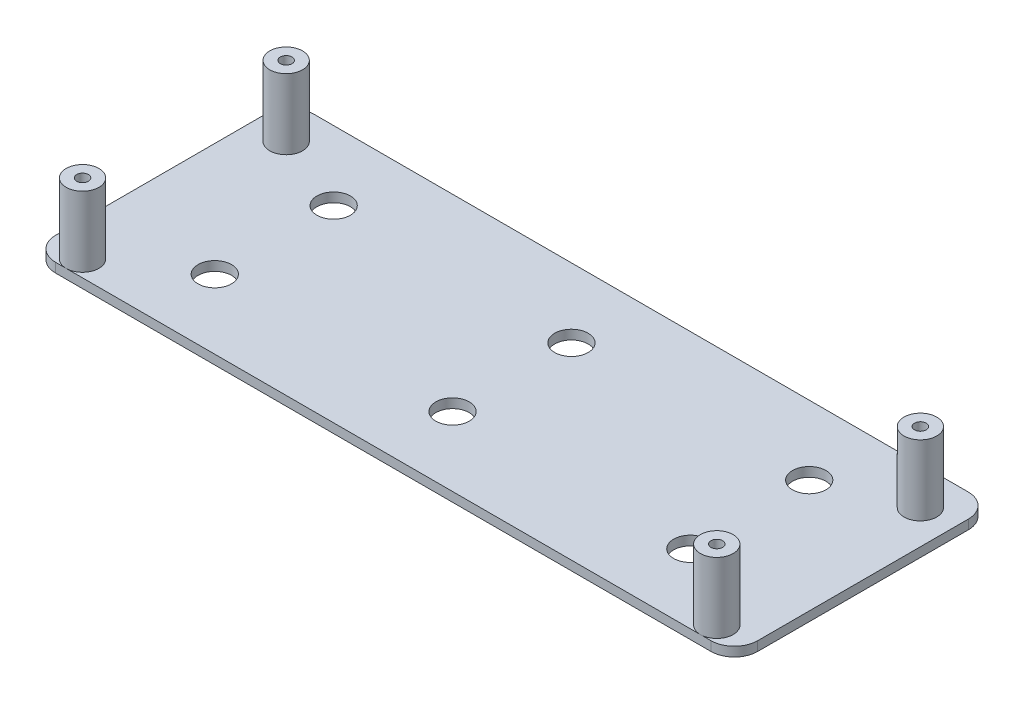
ISO-10303-21;
HEADER;
FILE_DESCRIPTION(('STEP AP214'),'2;1');
FILE_NAME('part.step','',(''),(''),'','','');
FILE_SCHEMA(('AUTOMOTIVE_DESIGN { 1 0 10303 214 1 1 1 1 }'));
ENDSEC;
DATA;
#1=APPLICATION_CONTEXT('core data for automotive mechanical design processes');
#2=APPLICATION_PROTOCOL_DEFINITION('international standard','automotive_design',2000,#1);
#3=PRODUCT_CONTEXT('',#1,'mechanical');
#4=PRODUCT('Part','Part','',(#3));
#5=PRODUCT_RELATED_PRODUCT_CATEGORY('part','',(#4));
#6=PRODUCT_DEFINITION_FORMATION('','',#4);
#7=PRODUCT_DEFINITION_CONTEXT('part definition',#1,'design');
#8=PRODUCT_DEFINITION('design','',#6,#7);
#9=PRODUCT_DEFINITION_SHAPE('','',#8);
#10=(LENGTH_UNIT() NAMED_UNIT(*) SI_UNIT(.MILLI.,.METRE.));
#11=(NAMED_UNIT(*) PLANE_ANGLE_UNIT() SI_UNIT($,.RADIAN.));
#12=(NAMED_UNIT(*) SI_UNIT($,.STERADIAN.) SOLID_ANGLE_UNIT());
#13=UNCERTAINTY_MEASURE_WITH_UNIT(LENGTH_MEASURE(1.E-05),#10,'distance_accuracy_value','');
#14=(GEOMETRIC_REPRESENTATION_CONTEXT(3) GLOBAL_UNCERTAINTY_ASSIGNED_CONTEXT((#13)) GLOBAL_UNIT_ASSIGNED_CONTEXT((#10,
#11,#12)) REPRESENTATION_CONTEXT('',''));
#15=CARTESIAN_POINT('',(0.,0.,0.));
#16=DIRECTION('',(0.,0.,1.));
#17=DIRECTION('',(1.,0.,0.));
#18=AXIS2_PLACEMENT_3D('',#15,#16,#17);
#19=CARTESIAN_POINT('',(67.75,-0.001000000000001,24.));
#20=DIRECTION('',(0.,1.,0.));
#21=DIRECTION('',(0.,0.,1.));
#22=AXIS2_PLACEMENT_3D('',#19,#20,#21);
#23=CYLINDRICAL_SURFACE('',#22,1.25);
#24=CARTESIAN_POINT('',(67.75,17.,24.));
#25=DIRECTION('',(0.,1.,0.));
#26=DIRECTION('',(0.,0.,1.));
#27=AXIS2_PLACEMENT_3D('',#24,#25,#26);
#28=CIRCLE('',#27,1.25);
#29=CARTESIAN_POINT('',(67.75,17.,25.25));
#30=VERTEX_POINT('',#29);
#31=EDGE_CURVE('E274',#30,#30,#28,.T.);
#32=ORIENTED_EDGE('',*,*,#31,.T.);
#33=EDGE_LOOP('',(#32));
#34=FACE_BOUND('',#33,.T.);
#35=CARTESIAN_POINT('',(67.75,10.,24.));
#36=DIRECTION('',(0.,-1.,0.));
#37=DIRECTION('',(0.,0.,-1.));
#38=AXIS2_PLACEMENT_3D('',#35,#36,#37);
#39=CIRCLE('',#38,1.25);
#40=CARTESIAN_POINT('',(67.75,10.,22.75));
#41=VERTEX_POINT('',#40);
#42=EDGE_CURVE('E45',#41,#41,#39,.F.);
#43=ORIENTED_EDGE('',*,*,#42,.F.);
#44=EDGE_LOOP('',(#43));
#45=FACE_BOUND('',#44,.T.);
#46=ADVANCED_FACE('F41',(#34,#45),#23,.F.);
#47=CARTESIAN_POINT('',(67.75,-0.001000000000001,-19.5));
#48=DIRECTION('',(0.,1.,0.));
#49=DIRECTION('',(0.,0.,1.));
#50=AXIS2_PLACEMENT_3D('',#47,#48,#49);
#51=CYLINDRICAL_SURFACE('',#50,1.25);
#52=CARTESIAN_POINT('',(67.75,17.,-19.5));
#53=DIRECTION('',(0.,1.,0.));
#54=DIRECTION('',(0.,0.,1.));
#55=AXIS2_PLACEMENT_3D('',#52,#53,#54);
#56=CIRCLE('',#55,1.25);
#57=CARTESIAN_POINT('',(67.75,17.,-18.25));
#58=VERTEX_POINT('',#57);
#59=EDGE_CURVE('E280',#58,#58,#56,.T.);
#60=ORIENTED_EDGE('',*,*,#59,.T.);
#61=EDGE_LOOP('',(#60));
#62=FACE_BOUND('',#61,.T.);
#63=CARTESIAN_POINT('',(67.75,10.,-19.5));
#64=DIRECTION('',(0.,-1.,0.));
#65=DIRECTION('',(0.,0.,-1.));
#66=AXIS2_PLACEMENT_3D('',#63,#64,#65);
#67=CIRCLE('',#66,1.25);
#68=CARTESIAN_POINT('',(67.75,10.,-20.75));
#69=VERTEX_POINT('',#68);
#70=EDGE_CURVE('E211',#69,#69,#67,.F.);
#71=ORIENTED_EDGE('',*,*,#70,.F.);
#72=EDGE_LOOP('',(#71));
#73=FACE_BOUND('',#72,.T.);
#74=ADVANCED_FACE('F357',(#62,#73),#51,.F.);
#75=CARTESIAN_POINT('',(-67.75,-0.001000000000001,-19.5));
#76=DIRECTION('',(0.,1.,0.));
#77=DIRECTION('',(0.,0.,1.));
#78=AXIS2_PLACEMENT_3D('',#75,#76,#77);
#79=CYLINDRICAL_SURFACE('',#78,1.25);
#80=CARTESIAN_POINT('',(-67.75,17.,-19.5));
#81=DIRECTION('',(0.,1.,0.));
#82=DIRECTION('',(0.,0.,1.));
#83=AXIS2_PLACEMENT_3D('',#80,#81,#82);
#84=CIRCLE('',#83,1.25);
#85=CARTESIAN_POINT('',(-67.75,17.,-18.25));
#86=VERTEX_POINT('',#85);
#87=EDGE_CURVE('E275',#86,#86,#84,.T.);
#88=ORIENTED_EDGE('',*,*,#87,.T.);
#89=EDGE_LOOP('',(#88));
#90=FACE_BOUND('',#89,.T.);
#91=CARTESIAN_POINT('',(-67.75,10.,-19.5));
#92=DIRECTION('',(0.,-1.,0.));
#93=DIRECTION('',(0.,0.,-1.));
#94=AXIS2_PLACEMENT_3D('',#91,#92,#93);
#95=CIRCLE('',#94,1.25);
#96=CARTESIAN_POINT('',(-67.75,10.,-20.75));
#97=VERTEX_POINT('',#96);
#98=EDGE_CURVE('E207',#97,#97,#95,.F.);
#99=ORIENTED_EDGE('',*,*,#98,.F.);
#100=EDGE_LOOP('',(#99));
#101=FACE_BOUND('',#100,.T.);
#102=ADVANCED_FACE('F363',(#90,#101),#79,.F.);
#103=CARTESIAN_POINT('',(-67.75,-0.001000000000001,24.));
#104=DIRECTION('',(0.,1.,0.));
#105=DIRECTION('',(0.,0.,1.));
#106=AXIS2_PLACEMENT_3D('',#103,#104,#105);
#107=CYLINDRICAL_SURFACE('',#106,1.25);
#108=CARTESIAN_POINT('',(-67.75,17.,24.));
#109=DIRECTION('',(0.,1.,0.));
#110=DIRECTION('',(0.,0.,1.));
#111=AXIS2_PLACEMENT_3D('',#108,#109,#110);
#112=CIRCLE('',#111,1.25);
#113=CARTESIAN_POINT('',(-67.75,17.,25.25));
#114=VERTEX_POINT('',#113);
#115=EDGE_CURVE('E279',#114,#114,#112,.T.);
#116=ORIENTED_EDGE('',*,*,#115,.T.);
#117=EDGE_LOOP('',(#116));
#118=FACE_BOUND('',#117,.T.);
#119=CARTESIAN_POINT('',(-67.75,10.,24.));
#120=DIRECTION('',(0.,-1.,0.));
#121=DIRECTION('',(0.,0.,-1.));
#122=AXIS2_PLACEMENT_3D('',#119,#120,#121);
#123=CIRCLE('',#122,1.25);
#124=CARTESIAN_POINT('',(-67.75,10.,22.75));
#125=VERTEX_POINT('',#124);
#126=EDGE_CURVE('E203',#125,#125,#123,.F.);
#127=ORIENTED_EDGE('',*,*,#126,.F.);
#128=EDGE_LOOP('',(#127));
#129=FACE_BOUND('',#128,.T.);
#130=ADVANCED_FACE('F369',(#118,#129),#107,.F.);
#131=CARTESIAN_POINT('',(0.,2.,0.));
#132=DIRECTION('',(0.,-1.,0.));
#133=DIRECTION('',(0.,0.,-1.));
#134=AXIS2_PLACEMENT_3D('',#131,#132,#133);
#135=PLANE('',#134);
#136=CARTESIAN_POINT('',(67.75,2.,-19.5));
#137=DIRECTION('',(0.,-1.,0.));
#138=DIRECTION('',(0.,0.,-1.));
#139=AXIS2_PLACEMENT_3D('',#136,#137,#138);
#140=CIRCLE('',#139,3.50000000000002);
#141=CARTESIAN_POINT('',(67.75,2.,-23.));
#142=VERTEX_POINT('',#141);
#143=EDGE_CURVE('E146',#142,#142,#140,.F.);
#144=ORIENTED_EDGE('',*,*,#143,.F.);
#145=EDGE_LOOP('',(#144));
#146=FACE_BOUND('',#145,.T.);
#147=CARTESIAN_POINT('',(-67.75,2.,-19.5));
#148=DIRECTION('',(0.,-1.,0.));
#149=DIRECTION('',(0.,0.,-1.));
#150=AXIS2_PLACEMENT_3D('',#147,#148,#149);
#151=CIRCLE('',#150,3.50000000000002);
#152=CARTESIAN_POINT('',(-67.75,2.,-23.));
#153=VERTEX_POINT('',#152);
#154=EDGE_CURVE('E143',#153,#153,#151,.F.);
#155=ORIENTED_EDGE('',*,*,#154,.F.);
#156=EDGE_LOOP('',(#155));
#157=FACE_BOUND('',#156,.T.);
#158=DIRECTION('',(-1.,0.,0.));
#159=VECTOR('',#158,1.);
#160=CARTESIAN_POINT('',(-75.,2.,-27.5));
#161=LINE('',#160,#159);
#162=CARTESIAN_POINT('',(70.,2.,-27.5));
#163=VERTEX_POINT('',#162);
#164=CARTESIAN_POINT('',(-70.,2.,-27.5));
#165=VERTEX_POINT('',#164);
#166=EDGE_CURVE('E139',#163,#165,#161,.T.);
#167=ORIENTED_EDGE('',*,*,#166,.T.);
#168=CARTESIAN_POINT('',(-70.,2.,-22.5));
#169=DIRECTION('',(0.,-1.,0.));
#170=DIRECTION('',(0.,0.,-1.));
#171=AXIS2_PLACEMENT_3D('',#168,#169,#170);
#172=CIRCLE('',#171,5.);
#173=CARTESIAN_POINT('',(-75.,2.,-22.5));
#174=VERTEX_POINT('',#173);
#175=EDGE_CURVE('E191',#165,#174,#172,.F.);
#176=ORIENTED_EDGE('',*,*,#175,.T.);
#177=DIRECTION('',(0.,0.,1.));
#178=VECTOR('',#177,1.);
#179=CARTESIAN_POINT('',(-75.,2.,27.5));
#180=LINE('',#179,#178);
#181=CARTESIAN_POINT('',(-75.,2.,22.5));
#182=VERTEX_POINT('',#181);
#183=EDGE_CURVE('E137',#174,#182,#180,.T.);
#184=ORIENTED_EDGE('',*,*,#183,.T.);
#185=CARTESIAN_POINT('',(-70.,2.,22.5));
#186=DIRECTION('',(0.,-1.,0.));
#187=DIRECTION('',(0.,0.,-1.));
#188=AXIS2_PLACEMENT_3D('',#185,#186,#187);
#189=CIRCLE('',#188,5.);
#190=CARTESIAN_POINT('',(-70.,2.,27.5));
#191=VERTEX_POINT('',#190);
#192=EDGE_CURVE('E59',#182,#191,#189,.F.);
#193=ORIENTED_EDGE('',*,*,#192,.T.);
#194=DIRECTION('',(1.,0.,0.));
#195=VECTOR('',#194,1.);
#196=CARTESIAN_POINT('',(-75.,2.,27.5));
#197=LINE('',#196,#195);
#198=CARTESIAN_POINT('',(-67.75,2.,27.5));
#199=VERTEX_POINT('',#198);
#200=EDGE_CURVE('E129',#191,#199,#197,.T.);
#201=ORIENTED_EDGE('',*,*,#200,.T.);
#202=CARTESIAN_POINT('',(-67.75,2.,24.));
#203=DIRECTION('',(0.,1.,0.));
#204=DIRECTION('',(0.,0.,1.));
#205=AXIS2_PLACEMENT_3D('',#202,#203,#204);
#206=CIRCLE('',#205,3.50000000000002);
#207=EDGE_CURVE('E126',#199,#199,#206,.T.);
#208=ORIENTED_EDGE('',*,*,#207,.F.);
#209=CARTESIAN_POINT('',(67.75,2.,27.5));
#210=VERTEX_POINT('',#209);
#211=EDGE_CURVE('E117',#199,#210,#197,.T.);
#212=ORIENTED_EDGE('',*,*,#211,.T.);
#213=CARTESIAN_POINT('',(67.75,2.,24.));
#214=DIRECTION('',(0.,1.,0.));
#215=DIRECTION('',(0.,0.,1.));
#216=AXIS2_PLACEMENT_3D('',#213,#214,#215);
#217=CIRCLE('',#216,3.50000000000002);
#218=EDGE_CURVE('E124',#210,#210,#217,.T.);
#219=ORIENTED_EDGE('',*,*,#218,.F.);
#220=CARTESIAN_POINT('',(70.,2.,27.5));
#221=VERTEX_POINT('',#220);
#222=EDGE_CURVE('E130',#210,#221,#197,.T.);
#223=ORIENTED_EDGE('',*,*,#222,.T.);
#224=CARTESIAN_POINT('',(70.,2.,22.5));
#225=DIRECTION('',(0.,-1.,0.));
#226=DIRECTION('',(0.,0.,-1.));
#227=AXIS2_PLACEMENT_3D('',#224,#225,#226);
#228=CIRCLE('',#227,5.);
#229=CARTESIAN_POINT('',(75.,2.,22.5));
#230=VERTEX_POINT('',#229);
#231=EDGE_CURVE('E185',#221,#230,#228,.F.);
#232=ORIENTED_EDGE('',*,*,#231,.T.);
#233=DIRECTION('',(0.,0.,-1.));
#234=VECTOR('',#233,1.);
#235=CARTESIAN_POINT('',(75.,2.,27.5));
#236=LINE('',#235,#234);
#237=CARTESIAN_POINT('',(75.,2.,-22.5));
#238=VERTEX_POINT('',#237);
#239=EDGE_CURVE('E311',#230,#238,#236,.T.);
#240=ORIENTED_EDGE('',*,*,#239,.T.);
#241=CARTESIAN_POINT('',(70.,2.,-22.5));
#242=DIRECTION('',(0.,-1.,0.));
#243=DIRECTION('',(0.,0.,-1.));
#244=AXIS2_PLACEMENT_3D('',#241,#242,#243);
#245=CIRCLE('',#244,5.);
#246=EDGE_CURVE('E188',#238,#163,#245,.F.);
#247=ORIENTED_EDGE('',*,*,#246,.T.);
#248=EDGE_LOOP('',(#167,#176,#184,#193,#201,#208,#212,#219,#223,#232,#240,#247));
#249=FACE_BOUND('',#248,.T.);
#250=CARTESIAN_POINT('',(0.,2.,-12.7));
#251=DIRECTION('',(0.,1.,0.));
#252=DIRECTION('',(0.,0.,1.));
#253=AXIS2_PLACEMENT_3D('',#250,#251,#252);
#254=CIRCLE('',#253,3.57124);
#255=CARTESIAN_POINT('',(0.,2.,-9.12876));
#256=VERTEX_POINT('',#255);
#257=EDGE_CURVE('E266',#256,#256,#254,.T.);
#258=ORIENTED_EDGE('',*,*,#257,.F.);
#259=EDGE_LOOP('',(#258));
#260=FACE_BOUND('',#259,.T.);
#261=CARTESIAN_POINT('',(0.,2.,12.7));
#262=DIRECTION('',(0.,1.,0.));
#263=DIRECTION('',(0.,0.,1.));
#264=AXIS2_PLACEMENT_3D('',#261,#262,#263);
#265=CIRCLE('',#264,3.57124);
#266=CARTESIAN_POINT('',(0.,2.,16.27124));
#267=VERTEX_POINT('',#266);
#268=EDGE_CURVE('E258',#267,#267,#265,.T.);
#269=ORIENTED_EDGE('',*,*,#268,.F.);
#270=EDGE_LOOP('',(#269));
#271=FACE_BOUND('',#270,.T.);
#272=CARTESIAN_POINT('',(-50.8,2.,12.7));
#273=DIRECTION('',(0.,1.,0.));
#274=DIRECTION('',(0.,0.,1.));
#275=AXIS2_PLACEMENT_3D('',#272,#273,#274);
#276=CIRCLE('',#275,3.57124);
#277=CARTESIAN_POINT('',(-50.8,2.,16.27124));
#278=VERTEX_POINT('',#277);
#279=EDGE_CURVE('E250',#278,#278,#276,.T.);
#280=ORIENTED_EDGE('',*,*,#279,.F.);
#281=EDGE_LOOP('',(#280));
#282=FACE_BOUND('',#281,.T.);
#283=CARTESIAN_POINT('',(50.8,2.,12.7));
#284=DIRECTION('',(0.,1.,0.));
#285=DIRECTION('',(0.,0.,1.));
#286=AXIS2_PLACEMENT_3D('',#283,#284,#285);
#287=CIRCLE('',#286,3.57124);
#288=CARTESIAN_POINT('',(50.8,2.,16.27124));
#289=VERTEX_POINT('',#288);
#290=EDGE_CURVE('E242',#289,#289,#287,.T.);
#291=ORIENTED_EDGE('',*,*,#290,.F.);
#292=EDGE_LOOP('',(#291));
#293=FACE_BOUND('',#292,.T.);
#294=CARTESIAN_POINT('',(50.8,2.,-12.7));
#295=DIRECTION('',(0.,1.,0.));
#296=DIRECTION('',(0.,0.,1.));
#297=AXIS2_PLACEMENT_3D('',#294,#295,#296);
#298=CIRCLE('',#297,3.57124);
#299=CARTESIAN_POINT('',(50.8,2.,-9.12876));
#300=VERTEX_POINT('',#299);
#301=EDGE_CURVE('E229',#300,#300,#298,.T.);
#302=ORIENTED_EDGE('',*,*,#301,.F.);
#303=EDGE_LOOP('',(#302));
#304=FACE_BOUND('',#303,.T.);
#305=CARTESIAN_POINT('',(-50.8,2.,-12.7));
#306=DIRECTION('',(0.,1.,0.));
#307=DIRECTION('',(0.,0.,1.));
#308=AXIS2_PLACEMENT_3D('',#305,#306,#307);
#309=CIRCLE('',#308,3.57124);
#310=CARTESIAN_POINT('',(-50.8,2.,-9.12876));
#311=VERTEX_POINT('',#310);
#312=EDGE_CURVE('E218',#311,#311,#309,.T.);
#313=ORIENTED_EDGE('',*,*,#312,.F.);
#314=EDGE_LOOP('',(#313));
#315=FACE_BOUND('',#314,.T.);
#316=ADVANCED_FACE('F120',(#146,#157,#249,#260,#271,#282,#293,#304,#315),#135,.F.);
#317=CARTESIAN_POINT('',(75.,2.,27.5));
#318=DIRECTION('',(-1.,0.,0.));
#319=DIRECTION('',(0.,0.,1.));
#320=AXIS2_PLACEMENT_3D('',#317,#318,#319);
#321=PLANE('',#320);
#322=DIRECTION('',(0.,0.,-1.));
#323=VECTOR('',#322,1.);
#324=CARTESIAN_POINT('',(75.,0.,27.5));
#325=LINE('',#324,#323);
#326=CARTESIAN_POINT('',(75.,0.,22.5));
#327=VERTEX_POINT('',#326);
#328=CARTESIAN_POINT('',(75.,0.,-22.5));
#329=VERTEX_POINT('',#328);
#330=EDGE_CURVE('E308',#327,#329,#325,.T.);
#331=ORIENTED_EDGE('',*,*,#330,.T.);
#332=DIRECTION('',(0.,-1.,0.));
#333=VECTOR('',#332,1.);
#334=CARTESIAN_POINT('',(75.,2.,-22.5));
#335=LINE('',#334,#333);
#336=EDGE_CURVE('E67',#329,#238,#335,.F.);
#337=ORIENTED_EDGE('',*,*,#336,.T.);
#338=ORIENTED_EDGE('',*,*,#239,.F.);
#339=DIRECTION('',(0.,-1.,0.));
#340=VECTOR('',#339,1.);
#341=CARTESIAN_POINT('',(75.,2.,22.5));
#342=LINE('',#341,#340);
#343=EDGE_CURVE('E194',#230,#327,#342,.T.);
#344=ORIENTED_EDGE('',*,*,#343,.T.);
#345=EDGE_LOOP('',(#331,#337,#338,#344));
#346=FACE_BOUND('',#345,.T.);
#347=ADVANCED_FACE('F343',(#346),#321,.F.);
#348=CARTESIAN_POINT('',(-75.,2.,-27.5));
#349=DIRECTION('',(0.,0.,1.));
#350=DIRECTION('',(1.,0.,0.));
#351=AXIS2_PLACEMENT_3D('',#348,#349,#350);
#352=PLANE('',#351);
#353=DIRECTION('',(-1.,0.,0.));
#354=VECTOR('',#353,1.);
#355=CARTESIAN_POINT('',(-75.,0.,-27.5));
#356=LINE('',#355,#354);
#357=CARTESIAN_POINT('',(70.,0.,-27.5));
#358=VERTEX_POINT('',#357);
#359=CARTESIAN_POINT('',(-70.,0.,-27.5));
#360=VERTEX_POINT('',#359);
#361=EDGE_CURVE('E337',#358,#360,#356,.T.);
#362=ORIENTED_EDGE('',*,*,#361,.T.);
#363=DIRECTION('',(0.,-1.,0.));
#364=VECTOR('',#363,1.);
#365=CARTESIAN_POINT('',(-70.,2.,-27.5));
#366=LINE('',#365,#364);
#367=EDGE_CURVE('E180',#360,#165,#366,.F.);
#368=ORIENTED_EDGE('',*,*,#367,.T.);
#369=ORIENTED_EDGE('',*,*,#166,.F.);
#370=DIRECTION('',(0.,-1.,0.));
#371=VECTOR('',#370,1.);
#372=CARTESIAN_POINT('',(70.,2.,-27.5));
#373=LINE('',#372,#371);
#374=EDGE_CURVE('E176',#163,#358,#373,.T.);
#375=ORIENTED_EDGE('',*,*,#374,.T.);
#376=EDGE_LOOP('',(#362,#368,#369,#375));
#377=FACE_BOUND('',#376,.T.);
#378=ADVANCED_FACE('F347',(#377),#352,.F.);
#379=CARTESIAN_POINT('',(-75.,2.,27.5));
#380=DIRECTION('',(1.,0.,0.));
#381=DIRECTION('',(0.,0.,-1.));
#382=AXIS2_PLACEMENT_3D('',#379,#380,#381);
#383=PLANE('',#382);
#384=ORIENTED_EDGE('',*,*,#183,.F.);
#385=DIRECTION('',(0.,-1.,0.));
#386=VECTOR('',#385,1.);
#387=CARTESIAN_POINT('',(-75.,2.,-22.5));
#388=LINE('',#387,#386);
#389=CARTESIAN_POINT('',(-75.,0.,-22.5));
#390=VERTEX_POINT('',#389);
#391=EDGE_CURVE('E160',#174,#390,#388,.T.);
#392=ORIENTED_EDGE('',*,*,#391,.T.);
#393=DIRECTION('',(0.,0.,1.));
#394=VECTOR('',#393,1.);
#395=CARTESIAN_POINT('',(-75.,0.,27.5));
#396=LINE('',#395,#394);
#397=CARTESIAN_POINT('',(-75.,0.,22.5));
#398=VERTEX_POINT('',#397);
#399=EDGE_CURVE('E329',#390,#398,#396,.T.);
#400=ORIENTED_EDGE('',*,*,#399,.T.);
#401=DIRECTION('',(0.,-1.,0.));
#402=VECTOR('',#401,1.);
#403=CARTESIAN_POINT('',(-75.,2.,22.5));
#404=LINE('',#403,#402);
#405=EDGE_CURVE('E152',#398,#182,#404,.F.);
#406=ORIENTED_EDGE('',*,*,#405,.T.);
#407=EDGE_LOOP('',(#384,#392,#400,#406));
#408=FACE_BOUND('',#407,.T.);
#409=ADVANCED_FACE('F328',(#408),#383,.F.);
#410=CARTESIAN_POINT('',(-75.,2.,27.5));
#411=DIRECTION('',(0.,0.,-1.));
#412=DIRECTION('',(-1.,0.,0.));
#413=AXIS2_PLACEMENT_3D('',#410,#411,#412);
#414=PLANE('',#413);
#415=DIRECTION('',(1.,0.,0.));
#416=VECTOR('',#415,1.);
#417=CARTESIAN_POINT('',(-75.,0.,27.5));
#418=LINE('',#417,#416);
#419=CARTESIAN_POINT('',(-70.,0.,27.5));
#420=VERTEX_POINT('',#419);
#421=CARTESIAN_POINT('',(70.,0.,27.5));
#422=VERTEX_POINT('',#421);
#423=EDGE_CURVE('E155',#420,#422,#418,.T.);
#424=ORIENTED_EDGE('',*,*,#423,.T.);
#425=DIRECTION('',(0.,-1.,0.));
#426=VECTOR('',#425,1.);
#427=CARTESIAN_POINT('',(70.,2.,27.5));
#428=LINE('',#427,#426);
#429=EDGE_CURVE('E11',#422,#221,#428,.F.);
#430=ORIENTED_EDGE('',*,*,#429,.T.);
#431=ORIENTED_EDGE('',*,*,#222,.F.);
#432=ORIENTED_EDGE('',*,*,#211,.F.);
#433=ORIENTED_EDGE('',*,*,#200,.F.);
#434=DIRECTION('',(0.,-1.,0.));
#435=VECTOR('',#434,1.);
#436=CARTESIAN_POINT('',(-70.,2.,27.5));
#437=LINE('',#436,#435);
#438=EDGE_CURVE('E51',#191,#420,#437,.T.);
#439=ORIENTED_EDGE('',*,*,#438,.T.);
#440=EDGE_LOOP('',(#424,#430,#431,#432,#433,#439));
#441=FACE_BOUND('',#440,.T.);
#442=ADVANCED_FACE('F133',(#441),#414,.F.);
#443=CARTESIAN_POINT('',(0.,0.,0.));
#444=DIRECTION('',(0.,-1.,0.));
#445=DIRECTION('',(0.,0.,-1.));
#446=AXIS2_PLACEMENT_3D('',#443,#444,#445);
#447=PLANE('',#446);
#448=CARTESIAN_POINT('',(67.75,0.,24.));
#449=DIRECTION('',(0.,-1.,0.));
#450=DIRECTION('',(0.,0.,-1.));
#451=AXIS2_PLACEMENT_3D('',#448,#449,#450);
#452=CIRCLE('',#451,2.1);
#453=CARTESIAN_POINT('',(67.75,0.,21.9));
#454=VERTEX_POINT('',#453);
#455=EDGE_CURVE('E704',#454,#454,#452,.T.);
#456=ORIENTED_EDGE('',*,*,#455,.F.);
#457=EDGE_LOOP('',(#456));
#458=FACE_BOUND('',#457,.T.);
#459=CARTESIAN_POINT('',(67.75,0.,-19.5));
#460=DIRECTION('',(0.,-1.,0.));
#461=DIRECTION('',(0.,0.,-1.));
#462=AXIS2_PLACEMENT_3D('',#459,#460,#461);
#463=CIRCLE('',#462,2.1);
#464=CARTESIAN_POINT('',(67.75,0.,-21.6));
#465=VERTEX_POINT('',#464);
#466=EDGE_CURVE('E708',#465,#465,#463,.T.);
#467=ORIENTED_EDGE('',*,*,#466,.F.);
#468=EDGE_LOOP('',(#467));
#469=FACE_BOUND('',#468,.T.);
#470=CARTESIAN_POINT('',(-67.75,0.,-19.5));
#471=DIRECTION('',(0.,-1.,0.));
#472=DIRECTION('',(0.,0.,-1.));
#473=AXIS2_PLACEMENT_3D('',#470,#471,#472);
#474=CIRCLE('',#473,2.1);
#475=CARTESIAN_POINT('',(-67.75,0.,-21.6));
#476=VERTEX_POINT('',#475);
#477=EDGE_CURVE('E721',#476,#476,#474,.T.);
#478=ORIENTED_EDGE('',*,*,#477,.F.);
#479=EDGE_LOOP('',(#478));
#480=FACE_BOUND('',#479,.T.);
#481=CARTESIAN_POINT('',(-67.75,0.,24.));
#482=DIRECTION('',(0.,-1.,0.));
#483=DIRECTION('',(0.,0.,-1.));
#484=AXIS2_PLACEMENT_3D('',#481,#482,#483);
#485=CIRCLE('',#484,2.1);
#486=CARTESIAN_POINT('',(-67.75,0.,21.9));
#487=VERTEX_POINT('',#486);
#488=EDGE_CURVE('E232',#487,#487,#485,.T.);
#489=ORIENTED_EDGE('',*,*,#488,.F.);
#490=EDGE_LOOP('',(#489));
#491=FACE_BOUND('',#490,.T.);
#492=CARTESIAN_POINT('',(-50.8,0.,-12.7));
#493=DIRECTION('',(0.,-1.,0.));
#494=DIRECTION('',(0.,0.,-1.));
#495=AXIS2_PLACEMENT_3D('',#492,#493,#494);
#496=CIRCLE('',#495,3.57124);
#497=CARTESIAN_POINT('',(-50.8,0.,-16.27124));
#498=VERTEX_POINT('',#497);
#499=EDGE_CURVE('E223',#498,#498,#496,.T.);
#500=ORIENTED_EDGE('',*,*,#499,.F.);
#501=EDGE_LOOP('',(#500));
#502=FACE_BOUND('',#501,.T.);
#503=CARTESIAN_POINT('',(50.8,0.,-12.7));
#504=DIRECTION('',(0.,-1.,0.));
#505=DIRECTION('',(0.,0.,-1.));
#506=AXIS2_PLACEMENT_3D('',#503,#504,#505);
#507=CIRCLE('',#506,3.57124);
#508=CARTESIAN_POINT('',(50.8,0.,-16.27124));
#509=VERTEX_POINT('',#508);
#510=EDGE_CURVE('E238',#509,#509,#507,.T.);
#511=ORIENTED_EDGE('',*,*,#510,.F.);
#512=EDGE_LOOP('',(#511));
#513=FACE_BOUND('',#512,.T.);
#514=CARTESIAN_POINT('',(50.8,0.,12.7));
#515=DIRECTION('',(0.,-1.,0.));
#516=DIRECTION('',(0.,0.,-1.));
#517=AXIS2_PLACEMENT_3D('',#514,#515,#516);
#518=CIRCLE('',#517,3.57124);
#519=CARTESIAN_POINT('',(50.8,0.,9.12876));
#520=VERTEX_POINT('',#519);
#521=EDGE_CURVE('E246',#520,#520,#518,.T.);
#522=ORIENTED_EDGE('',*,*,#521,.F.);
#523=EDGE_LOOP('',(#522));
#524=FACE_BOUND('',#523,.T.);
#525=CARTESIAN_POINT('',(-50.8,0.,12.7));
#526=DIRECTION('',(0.,-1.,0.));
#527=DIRECTION('',(0.,0.,-1.));
#528=AXIS2_PLACEMENT_3D('',#525,#526,#527);
#529=CIRCLE('',#528,3.57124);
#530=CARTESIAN_POINT('',(-50.8,0.,9.12876));
#531=VERTEX_POINT('',#530);
#532=EDGE_CURVE('E254',#531,#531,#529,.T.);
#533=ORIENTED_EDGE('',*,*,#532,.F.);
#534=EDGE_LOOP('',(#533));
#535=FACE_BOUND('',#534,.T.);
#536=CARTESIAN_POINT('',(0.,0.,12.7));
#537=DIRECTION('',(0.,-1.,0.));
#538=DIRECTION('',(0.,0.,-1.));
#539=AXIS2_PLACEMENT_3D('',#536,#537,#538);
#540=CIRCLE('',#539,3.57124);
#541=CARTESIAN_POINT('',(0.,0.,9.12876));
#542=VERTEX_POINT('',#541);
#543=EDGE_CURVE('E262',#542,#542,#540,.T.);
#544=ORIENTED_EDGE('',*,*,#543,.F.);
#545=EDGE_LOOP('',(#544));
#546=FACE_BOUND('',#545,.T.);
#547=CARTESIAN_POINT('',(0.,0.,-12.7));
#548=DIRECTION('',(0.,-1.,0.));
#549=DIRECTION('',(0.,0.,-1.));
#550=AXIS2_PLACEMENT_3D('',#547,#548,#549);
#551=CIRCLE('',#550,3.57124);
#552=CARTESIAN_POINT('',(0.,0.,-16.27124));
#553=VERTEX_POINT('',#552);
#554=EDGE_CURVE('E270',#553,#553,#551,.T.);
#555=ORIENTED_EDGE('',*,*,#554,.F.);
#556=EDGE_LOOP('',(#555));
#557=FACE_BOUND('',#556,.T.);
#558=ORIENTED_EDGE('',*,*,#399,.F.);
#559=CARTESIAN_POINT('',(-70.,0.,-22.5));
#560=DIRECTION('',(0.,-1.,0.));
#561=DIRECTION('',(0.,0.,-1.));
#562=AXIS2_PLACEMENT_3D('',#559,#560,#561);
#563=CIRCLE('',#562,5.);
#564=EDGE_CURVE('E173',#390,#360,#563,.T.);
#565=ORIENTED_EDGE('',*,*,#564,.T.);
#566=ORIENTED_EDGE('',*,*,#361,.F.);
#567=CARTESIAN_POINT('',(70.,0.,-22.5));
#568=DIRECTION('',(0.,-1.,0.));
#569=DIRECTION('',(0.,0.,-1.));
#570=AXIS2_PLACEMENT_3D('',#567,#568,#569);
#571=CIRCLE('',#570,5.);
#572=EDGE_CURVE('E170',#358,#329,#571,.T.);
#573=ORIENTED_EDGE('',*,*,#572,.T.);
#574=ORIENTED_EDGE('',*,*,#330,.F.);
#575=CARTESIAN_POINT('',(70.,0.,22.5));
#576=DIRECTION('',(0.,-1.,0.));
#577=DIRECTION('',(0.,0.,-1.));
#578=AXIS2_PLACEMENT_3D('',#575,#576,#577);
#579=CIRCLE('',#578,5.);
#580=EDGE_CURVE('E167',#327,#422,#579,.T.);
#581=ORIENTED_EDGE('',*,*,#580,.T.);
#582=ORIENTED_EDGE('',*,*,#423,.F.);
#583=CARTESIAN_POINT('',(-70.,0.,22.5));
#584=DIRECTION('',(0.,-1.,0.));
#585=DIRECTION('',(0.,0.,-1.));
#586=AXIS2_PLACEMENT_3D('',#583,#584,#585);
#587=CIRCLE('',#586,5.);
#588=EDGE_CURVE('E164',#420,#398,#587,.T.);
#589=ORIENTED_EDGE('',*,*,#588,.T.);
#590=EDGE_LOOP('',(#558,#565,#566,#573,#574,#581,#582,#589));
#591=FACE_BOUND('',#590,.T.);
#592=ADVANCED_FACE('F332',(#458,#469,#480,#491,#502,#513,#524,#535,#546,#557,#591),#447,.T.);
#593=CARTESIAN_POINT('',(-67.75,17.,24.));
#594=DIRECTION('',(0.,-1.,0.));
#595=DIRECTION('',(0.,0.,-1.));
#596=AXIS2_PLACEMENT_3D('',#593,#594,#595);
#597=CYLINDRICAL_SURFACE('',#596,3.50000000000002);
#598=CARTESIAN_POINT('',(-67.75,17.,24.));
#599=DIRECTION('',(0.,1.,0.));
#600=DIRECTION('',(0.,0.,1.));
#601=AXIS2_PLACEMENT_3D('',#598,#599,#600);
#602=CIRCLE('',#601,3.50000000000002);
#603=CARTESIAN_POINT('',(-67.75,17.,27.5));
#604=VERTEX_POINT('',#603);
#605=EDGE_CURVE('E304',#604,#604,#602,.T.);
#606=ORIENTED_EDGE('',*,*,#605,.F.);
#607=EDGE_LOOP('',(#606));
#608=FACE_BOUND('',#607,.T.);
#609=ORIENTED_EDGE('',*,*,#207,.T.);
#610=EDGE_LOOP('',(#609));
#611=FACE_BOUND('',#610,.T.);
#612=ADVANCED_FACE('F400',(#608,#611),#597,.T.);
#613=CARTESIAN_POINT('',(-67.75,17.,24.));
#614=DIRECTION('',(0.,1.,0.));
#615=DIRECTION('',(0.,0.,1.));
#616=AXIS2_PLACEMENT_3D('',#613,#614,#615);
#617=PLANE('',#616);
#618=ORIENTED_EDGE('',*,*,#115,.F.);
#619=EDGE_LOOP('',(#618));
#620=FACE_BOUND('',#619,.T.);
#621=ORIENTED_EDGE('',*,*,#605,.T.);
#622=EDGE_LOOP('',(#621));
#623=FACE_BOUND('',#622,.T.);
#624=ADVANCED_FACE('F396',(#620,#623),#617,.T.);
#625=CARTESIAN_POINT('',(-67.75,17.,-19.5));
#626=DIRECTION('',(0.,-1.,0.));
#627=DIRECTION('',(0.,0.,-1.));
#628=AXIS2_PLACEMENT_3D('',#625,#626,#627);
#629=CYLINDRICAL_SURFACE('',#628,3.50000000000002);
#630=CARTESIAN_POINT('',(-67.75,17.,-19.5));
#631=DIRECTION('',(0.,1.,0.));
#632=DIRECTION('',(0.,0.,1.));
#633=AXIS2_PLACEMENT_3D('',#630,#631,#632);
#634=CIRCLE('',#633,3.50000000000002);
#635=CARTESIAN_POINT('',(-67.75,17.,-16.));
#636=VERTEX_POINT('',#635);
#637=EDGE_CURVE('E300',#636,#636,#634,.T.);
#638=ORIENTED_EDGE('',*,*,#637,.F.);
#639=EDGE_LOOP('',(#638));
#640=FACE_BOUND('',#639,.T.);
#641=ORIENTED_EDGE('',*,*,#154,.T.);
#642=EDGE_LOOP('',(#641));
#643=FACE_BOUND('',#642,.T.);
#644=ADVANCED_FACE('F392',(#640,#643),#629,.T.);
#645=CARTESIAN_POINT('',(-67.75,17.,-19.5));
#646=DIRECTION('',(0.,1.,0.));
#647=DIRECTION('',(0.,0.,1.));
#648=AXIS2_PLACEMENT_3D('',#645,#646,#647);
#649=PLANE('',#648);
#650=ORIENTED_EDGE('',*,*,#87,.F.);
#651=EDGE_LOOP('',(#650));
#652=FACE_BOUND('',#651,.T.);
#653=ORIENTED_EDGE('',*,*,#637,.T.);
#654=EDGE_LOOP('',(#653));
#655=FACE_BOUND('',#654,.T.);
#656=ADVANCED_FACE('F388',(#652,#655),#649,.T.);
#657=CARTESIAN_POINT('',(67.75,17.,-19.5));
#658=DIRECTION('',(0.,-1.,0.));
#659=DIRECTION('',(0.,0.,-1.));
#660=AXIS2_PLACEMENT_3D('',#657,#658,#659);
#661=CYLINDRICAL_SURFACE('',#660,3.50000000000002);
#662=CARTESIAN_POINT('',(67.75,17.,-19.5));
#663=DIRECTION('',(0.,1.,0.));
#664=DIRECTION('',(0.,0.,1.));
#665=AXIS2_PLACEMENT_3D('',#662,#663,#664);
#666=CIRCLE('',#665,3.50000000000002);
#667=CARTESIAN_POINT('',(67.75,17.,-16.));
#668=VERTEX_POINT('',#667);
#669=EDGE_CURVE('E294',#668,#668,#666,.T.);
#670=ORIENTED_EDGE('',*,*,#669,.F.);
#671=EDGE_LOOP('',(#670));
#672=FACE_BOUND('',#671,.T.);
#673=ORIENTED_EDGE('',*,*,#143,.T.);
#674=EDGE_LOOP('',(#673));
#675=FACE_BOUND('',#674,.T.);
#676=ADVANCED_FACE('F384',(#672,#675),#661,.T.);
#677=CARTESIAN_POINT('',(67.75,17.,-19.5));
#678=DIRECTION('',(0.,1.,0.));
#679=DIRECTION('',(0.,0.,1.));
#680=AXIS2_PLACEMENT_3D('',#677,#678,#679);
#681=PLANE('',#680);
#682=ORIENTED_EDGE('',*,*,#59,.F.);
#683=EDGE_LOOP('',(#682));
#684=FACE_BOUND('',#683,.T.);
#685=ORIENTED_EDGE('',*,*,#669,.T.);
#686=EDGE_LOOP('',(#685));
#687=FACE_BOUND('',#686,.T.);
#688=ADVANCED_FACE('F380',(#684,#687),#681,.T.);
#689=CARTESIAN_POINT('',(67.75,17.,24.));
#690=DIRECTION('',(0.,-1.,0.));
#691=DIRECTION('',(0.,0.,-1.));
#692=AXIS2_PLACEMENT_3D('',#689,#690,#691);
#693=CYLINDRICAL_SURFACE('',#692,3.50000000000002);
#694=CARTESIAN_POINT('',(67.75,17.,24.));
#695=DIRECTION('',(0.,1.,0.));
#696=DIRECTION('',(0.,0.,1.));
#697=AXIS2_PLACEMENT_3D('',#694,#695,#696);
#698=CIRCLE('',#697,3.50000000000002);
#699=CARTESIAN_POINT('',(67.75,17.,27.5));
#700=VERTEX_POINT('',#699);
#701=EDGE_CURVE('E290',#700,#700,#698,.T.);
#702=ORIENTED_EDGE('',*,*,#701,.F.);
#703=EDGE_LOOP('',(#702));
#704=FACE_BOUND('',#703,.T.);
#705=ORIENTED_EDGE('',*,*,#218,.T.);
#706=EDGE_LOOP('',(#705));
#707=FACE_BOUND('',#706,.T.);
#708=ADVANCED_FACE('F376',(#704,#707),#693,.T.);
#709=CARTESIAN_POINT('',(67.75,17.,24.));
#710=DIRECTION('',(0.,1.,0.));
#711=DIRECTION('',(0.,0.,1.));
#712=AXIS2_PLACEMENT_3D('',#709,#710,#711);
#713=PLANE('',#712);
#714=ORIENTED_EDGE('',*,*,#31,.F.);
#715=EDGE_LOOP('',(#714));
#716=FACE_BOUND('',#715,.T.);
#717=ORIENTED_EDGE('',*,*,#701,.T.);
#718=EDGE_LOOP('',(#717));
#719=FACE_BOUND('',#718,.T.);
#720=ADVANCED_FACE('F373',(#716,#719),#713,.T.);
#721=CARTESIAN_POINT('',(-70.,2.,-22.5));
#722=DIRECTION('',(0.,-1.,0.));
#723=DIRECTION('',(0.,0.,-1.));
#724=AXIS2_PLACEMENT_3D('',#721,#722,#723);
#725=CYLINDRICAL_SURFACE('',#724,5.);
#726=ORIENTED_EDGE('',*,*,#175,.F.);
#727=ORIENTED_EDGE('',*,*,#367,.F.);
#728=ORIENTED_EDGE('',*,*,#564,.F.);
#729=ORIENTED_EDGE('',*,*,#391,.F.);
#730=EDGE_LOOP('',(#726,#727,#728,#729));
#731=FACE_BOUND('',#730,.T.);
#732=ADVANCED_FACE('F324',(#731),#725,.T.);
#733=CARTESIAN_POINT('',(70.,2.,-22.5));
#734=DIRECTION('',(0.,-1.,0.));
#735=DIRECTION('',(0.,0.,-1.));
#736=AXIS2_PLACEMENT_3D('',#733,#734,#735);
#737=CYLINDRICAL_SURFACE('',#736,5.);
#738=ORIENTED_EDGE('',*,*,#246,.F.);
#739=ORIENTED_EDGE('',*,*,#336,.F.);
#740=ORIENTED_EDGE('',*,*,#572,.F.);
#741=ORIENTED_EDGE('',*,*,#374,.F.);
#742=EDGE_LOOP('',(#738,#739,#740,#741));
#743=FACE_BOUND('',#742,.T.);
#744=ADVANCED_FACE('F346',(#743),#737,.T.);
#745=CARTESIAN_POINT('',(70.,2.,22.5));
#746=DIRECTION('',(0.,-1.,0.));
#747=DIRECTION('',(0.,0.,-1.));
#748=AXIS2_PLACEMENT_3D('',#745,#746,#747);
#749=CYLINDRICAL_SURFACE('',#748,5.);
#750=ORIENTED_EDGE('',*,*,#231,.F.);
#751=ORIENTED_EDGE('',*,*,#429,.F.);
#752=ORIENTED_EDGE('',*,*,#580,.F.);
#753=ORIENTED_EDGE('',*,*,#343,.F.);
#754=EDGE_LOOP('',(#750,#751,#752,#753));
#755=FACE_BOUND('',#754,.T.);
#756=ADVANCED_FACE('F465',(#755),#749,.T.);
#757=CARTESIAN_POINT('',(-70.,2.,22.5));
#758=DIRECTION('',(0.,-1.,0.));
#759=DIRECTION('',(0.,0.,-1.));
#760=AXIS2_PLACEMENT_3D('',#757,#758,#759);
#761=CYLINDRICAL_SURFACE('',#760,5.);
#762=ORIENTED_EDGE('',*,*,#192,.F.);
#763=ORIENTED_EDGE('',*,*,#405,.F.);
#764=ORIENTED_EDGE('',*,*,#588,.F.);
#765=ORIENTED_EDGE('',*,*,#438,.F.);
#766=EDGE_LOOP('',(#762,#763,#764,#765));
#767=FACE_BOUND('',#766,.T.);
#768=ADVANCED_FACE('F43',(#767),#761,.T.);
#769=CARTESIAN_POINT('',(0.,2.,-12.7));
#770=DIRECTION('',(0.,1.,0.));
#771=DIRECTION('',(0.,0.,1.));
#772=AXIS2_PLACEMENT_3D('',#769,#770,#771);
#773=CYLINDRICAL_SURFACE('',#772,3.57124);
#774=ORIENTED_EDGE('',*,*,#257,.T.);
#775=EDGE_LOOP('',(#774));
#776=FACE_BOUND('',#775,.T.);
#777=ORIENTED_EDGE('',*,*,#554,.T.);
#778=EDGE_LOOP('',(#777));
#779=FACE_BOUND('',#778,.T.);
#780=ADVANCED_FACE('F478',(#776,#779),#773,.F.);
#781=CARTESIAN_POINT('',(0.,2.,12.7));
#782=DIRECTION('',(0.,1.,0.));
#783=DIRECTION('',(0.,0.,1.));
#784=AXIS2_PLACEMENT_3D('',#781,#782,#783);
#785=CYLINDRICAL_SURFACE('',#784,3.57124);
#786=ORIENTED_EDGE('',*,*,#268,.T.);
#787=EDGE_LOOP('',(#786));
#788=FACE_BOUND('',#787,.T.);
#789=ORIENTED_EDGE('',*,*,#543,.T.);
#790=EDGE_LOOP('',(#789));
#791=FACE_BOUND('',#790,.T.);
#792=ADVANCED_FACE('F486',(#788,#791),#785,.F.);
#793=CARTESIAN_POINT('',(-50.8,2.,12.7));
#794=DIRECTION('',(0.,1.,0.));
#795=DIRECTION('',(0.,0.,1.));
#796=AXIS2_PLACEMENT_3D('',#793,#794,#795);
#797=CYLINDRICAL_SURFACE('',#796,3.57124);
#798=ORIENTED_EDGE('',*,*,#279,.T.);
#799=EDGE_LOOP('',(#798));
#800=FACE_BOUND('',#799,.T.);
#801=ORIENTED_EDGE('',*,*,#532,.T.);
#802=EDGE_LOOP('',(#801));
#803=FACE_BOUND('',#802,.T.);
#804=ADVANCED_FACE('F494',(#800,#803),#797,.F.);
#805=CARTESIAN_POINT('',(50.8,2.,12.7));
#806=DIRECTION('',(0.,1.,0.));
#807=DIRECTION('',(0.,0.,1.));
#808=AXIS2_PLACEMENT_3D('',#805,#806,#807);
#809=CYLINDRICAL_SURFACE('',#808,3.57124);
#810=ORIENTED_EDGE('',*,*,#290,.T.);
#811=EDGE_LOOP('',(#810));
#812=FACE_BOUND('',#811,.T.);
#813=ORIENTED_EDGE('',*,*,#521,.T.);
#814=EDGE_LOOP('',(#813));
#815=FACE_BOUND('',#814,.T.);
#816=ADVANCED_FACE('F502',(#812,#815),#809,.F.);
#817=CARTESIAN_POINT('',(50.8,2.,-12.7));
#818=DIRECTION('',(0.,1.,0.));
#819=DIRECTION('',(0.,0.,1.));
#820=AXIS2_PLACEMENT_3D('',#817,#818,#819);
#821=CYLINDRICAL_SURFACE('',#820,3.57124);
#822=ORIENTED_EDGE('',*,*,#301,.T.);
#823=EDGE_LOOP('',(#822));
#824=FACE_BOUND('',#823,.T.);
#825=ORIENTED_EDGE('',*,*,#510,.T.);
#826=EDGE_LOOP('',(#825));
#827=FACE_BOUND('',#826,.T.);
#828=ADVANCED_FACE('F510',(#824,#827),#821,.F.);
#829=CARTESIAN_POINT('',(-50.8,2.,-12.7));
#830=DIRECTION('',(0.,1.,0.));
#831=DIRECTION('',(0.,0.,1.));
#832=AXIS2_PLACEMENT_3D('',#829,#830,#831);
#833=CYLINDRICAL_SURFACE('',#832,3.57124);
#834=ORIENTED_EDGE('',*,*,#312,.T.);
#835=EDGE_LOOP('',(#834));
#836=FACE_BOUND('',#835,.T.);
#837=ORIENTED_EDGE('',*,*,#499,.T.);
#838=EDGE_LOOP('',(#837));
#839=FACE_BOUND('',#838,.T.);
#840=ADVANCED_FACE('F518',(#836,#839),#833,.F.);
#841=CARTESIAN_POINT('',(-67.75,10.,24.));
#842=DIRECTION('',(0.,-1.,0.));
#843=DIRECTION('',(0.,0.,-1.));
#844=AXIS2_PLACEMENT_3D('',#841,#842,#843);
#845=PLANE('',#844);
#846=CARTESIAN_POINT('',(-67.75,10.,24.));
#847=DIRECTION('',(0.,-1.,0.));
#848=DIRECTION('',(0.,0.,-1.));
#849=AXIS2_PLACEMENT_3D('',#846,#847,#848);
#850=CIRCLE('',#849,2.1);
#851=CARTESIAN_POINT('',(-67.75,10.,21.9));
#852=VERTEX_POINT('',#851);
#853=EDGE_CURVE('E208',#852,#852,#850,.T.);
#854=ORIENTED_EDGE('',*,*,#853,.T.);
#855=EDGE_LOOP('',(#854));
#856=FACE_BOUND('',#855,.T.);
#857=ORIENTED_EDGE('',*,*,#126,.T.);
#858=EDGE_LOOP('',(#857));
#859=FACE_BOUND('',#858,.T.);
#860=ADVANCED_FACE('F526',(#856,#859),#845,.T.);
#861=CARTESIAN_POINT('',(-67.75,10.,24.));
#862=DIRECTION('',(0.,-1.,0.));
#863=DIRECTION('',(0.,0.,-1.));
#864=AXIS2_PLACEMENT_3D('',#861,#862,#863);
#865=CYLINDRICAL_SURFACE('',#864,2.1);
#866=ORIENTED_EDGE('',*,*,#853,.F.);
#867=EDGE_LOOP('',(#866));
#868=FACE_BOUND('',#867,.T.);
#869=ORIENTED_EDGE('',*,*,#488,.T.);
#870=EDGE_LOOP('',(#869));
#871=FACE_BOUND('',#870,.T.);
#872=ADVANCED_FACE('F533',(#868,#871),#865,.F.);
#873=CARTESIAN_POINT('',(-67.75,10.,-19.5));
#874=DIRECTION('',(0.,-1.,0.));
#875=DIRECTION('',(0.,0.,-1.));
#876=AXIS2_PLACEMENT_3D('',#873,#874,#875);
#877=PLANE('',#876);
#878=CARTESIAN_POINT('',(-67.75,10.,-19.5));
#879=DIRECTION('',(0.,-1.,0.));
#880=DIRECTION('',(0.,0.,-1.));
#881=AXIS2_PLACEMENT_3D('',#878,#879,#880);
#882=CIRCLE('',#881,2.1);
#883=CARTESIAN_POINT('',(-67.75,10.,-21.6));
#884=VERTEX_POINT('',#883);
#885=EDGE_CURVE('E716',#884,#884,#882,.T.);
#886=ORIENTED_EDGE('',*,*,#885,.T.);
#887=EDGE_LOOP('',(#886));
#888=FACE_BOUND('',#887,.T.);
#889=ORIENTED_EDGE('',*,*,#98,.T.);
#890=EDGE_LOOP('',(#889));
#891=FACE_BOUND('',#890,.T.);
#892=ADVANCED_FACE('F541',(#888,#891),#877,.T.);
#893=CARTESIAN_POINT('',(-67.75,10.,-19.5));
#894=DIRECTION('',(0.,-1.,0.));
#895=DIRECTION('',(0.,0.,-1.));
#896=AXIS2_PLACEMENT_3D('',#893,#894,#895);
#897=CYLINDRICAL_SURFACE('',#896,2.1);
#898=ORIENTED_EDGE('',*,*,#885,.F.);
#899=EDGE_LOOP('',(#898));
#900=FACE_BOUND('',#899,.T.);
#901=ORIENTED_EDGE('',*,*,#477,.T.);
#902=EDGE_LOOP('',(#901));
#903=FACE_BOUND('',#902,.T.);
#904=ADVANCED_FACE('F549',(#900,#903),#897,.F.);
#905=CARTESIAN_POINT('',(67.75,10.,-19.5));
#906=DIRECTION('',(0.,-1.,0.));
#907=DIRECTION('',(0.,0.,-1.));
#908=AXIS2_PLACEMENT_3D('',#905,#906,#907);
#909=PLANE('',#908);
#910=CARTESIAN_POINT('',(67.75,10.,-19.5));
#911=DIRECTION('',(0.,-1.,0.));
#912=DIRECTION('',(0.,0.,-1.));
#913=AXIS2_PLACEMENT_3D('',#910,#911,#912);
#914=CIRCLE('',#913,2.1);
#915=CARTESIAN_POINT('',(67.75,10.,-21.6));
#916=VERTEX_POINT('',#915);
#917=EDGE_CURVE('E726',#916,#916,#914,.T.);
#918=ORIENTED_EDGE('',*,*,#917,.T.);
#919=EDGE_LOOP('',(#918));
#920=FACE_BOUND('',#919,.T.);
#921=ORIENTED_EDGE('',*,*,#70,.T.);
#922=EDGE_LOOP('',(#921));
#923=FACE_BOUND('',#922,.T.);
#924=ADVANCED_FACE('F557',(#920,#923),#909,.T.);
#925=CARTESIAN_POINT('',(67.75,10.,-19.5));
#926=DIRECTION('',(0.,-1.,0.));
#927=DIRECTION('',(0.,0.,-1.));
#928=AXIS2_PLACEMENT_3D('',#925,#926,#927);
#929=CYLINDRICAL_SURFACE('',#928,2.1);
#930=ORIENTED_EDGE('',*,*,#917,.F.);
#931=EDGE_LOOP('',(#930));
#932=FACE_BOUND('',#931,.T.);
#933=ORIENTED_EDGE('',*,*,#466,.T.);
#934=EDGE_LOOP('',(#933));
#935=FACE_BOUND('',#934,.T.);
#936=ADVANCED_FACE('F565',(#932,#935),#929,.F.);
#937=CARTESIAN_POINT('',(67.75,10.,24.));
#938=DIRECTION('',(0.,-1.,0.));
#939=DIRECTION('',(0.,0.,-1.));
#940=AXIS2_PLACEMENT_3D('',#937,#938,#939);
#941=PLANE('',#940);
#942=CARTESIAN_POINT('',(67.75,10.,24.));
#943=DIRECTION('',(0.,-1.,0.));
#944=DIRECTION('',(0.,0.,-1.));
#945=AXIS2_PLACEMENT_3D('',#942,#943,#944);
#946=CIRCLE('',#945,2.1);
#947=CARTESIAN_POINT('',(67.75,10.,21.9));
#948=VERTEX_POINT('',#947);
#949=EDGE_CURVE('E701',#948,#948,#946,.T.);
#950=ORIENTED_EDGE('',*,*,#949,.T.);
#951=EDGE_LOOP('',(#950));
#952=FACE_BOUND('',#951,.T.);
#953=ORIENTED_EDGE('',*,*,#42,.T.);
#954=EDGE_LOOP('',(#953));
#955=FACE_BOUND('',#954,.T.);
#956=ADVANCED_FACE('F573',(#952,#955),#941,.T.);
#957=CARTESIAN_POINT('',(67.75,10.,24.));
#958=DIRECTION('',(0.,-1.,0.));
#959=DIRECTION('',(0.,0.,-1.));
#960=AXIS2_PLACEMENT_3D('',#957,#958,#959);
#961=CYLINDRICAL_SURFACE('',#960,2.1);
#962=ORIENTED_EDGE('',*,*,#949,.F.);
#963=EDGE_LOOP('',(#962));
#964=FACE_BOUND('',#963,.T.);
#965=ORIENTED_EDGE('',*,*,#455,.T.);
#966=EDGE_LOOP('',(#965));
#967=FACE_BOUND('',#966,.T.);
#968=ADVANCED_FACE('F581',(#964,#967),#961,.F.);
#969=CLOSED_SHELL('',(#46,#74,#102,#130,#316,#347,#378,#409,#442,#592,#612,#624,#644,#656,#676,
#688,#708,#720,#732,#744,#756,#768,#780,#792,#804,#816,#828,#840,#860,#872,#892,#904,#924,#936,
#956,#968));
#970=MANIFOLD_SOLID_BREP('B2',#969);
#971=ADVANCED_BREP_SHAPE_REPRESENTATION('',(#18,#970),#14);
#972=SHAPE_DEFINITION_REPRESENTATION(#9,#971);
ENDSEC;
END-ISO-10303-21;
